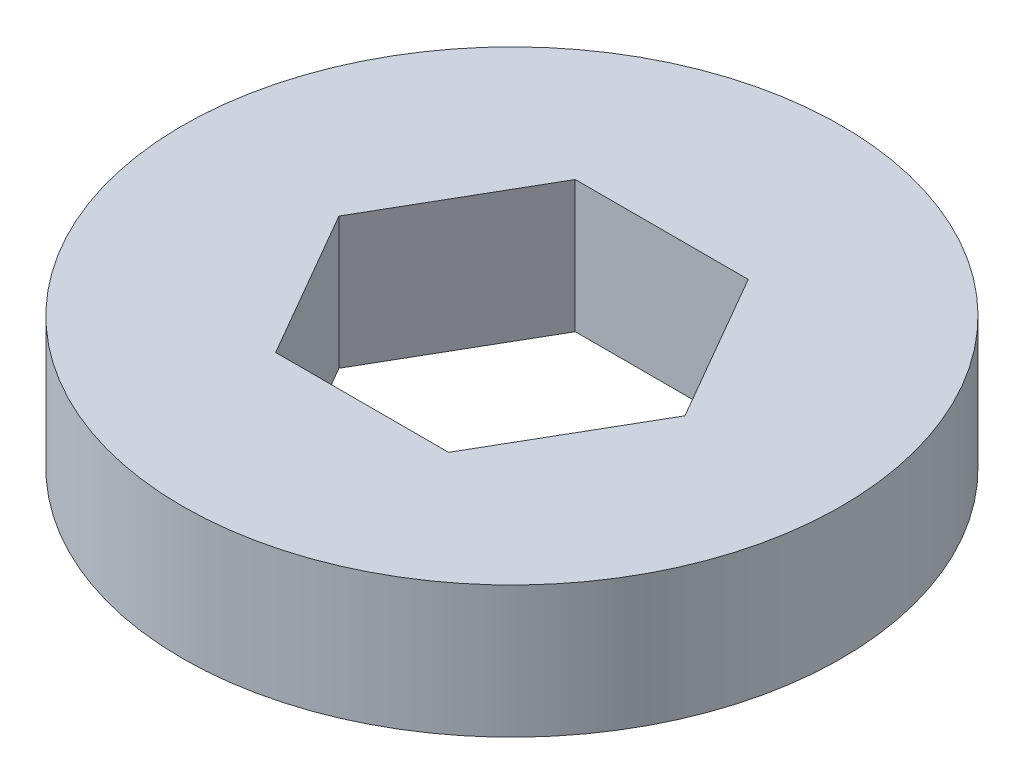
ISO-10303-21;
HEADER;
FILE_DESCRIPTION(('STEP AP214'),'2;1');
FILE_NAME('part.step','',(''),(''),'','','');
FILE_SCHEMA(('AUTOMOTIVE_DESIGN { 1 0 10303 214 1 1 1 1 }'));
ENDSEC;
DATA;
#1=APPLICATION_CONTEXT('core data for automotive mechanical design processes');
#2=APPLICATION_PROTOCOL_DEFINITION('international standard','automotive_design',2000,#1);
#3=PRODUCT_CONTEXT('',#1,'mechanical');
#4=PRODUCT('Part','Part','',(#3));
#5=PRODUCT_RELATED_PRODUCT_CATEGORY('part','',(#4));
#6=PRODUCT_DEFINITION_FORMATION('','',#4);
#7=PRODUCT_DEFINITION_CONTEXT('part definition',#1,'design');
#8=PRODUCT_DEFINITION('design','',#6,#7);
#9=PRODUCT_DEFINITION_SHAPE('','',#8);
#10=(LENGTH_UNIT() NAMED_UNIT(*) SI_UNIT(.MILLI.,.METRE.));
#11=(NAMED_UNIT(*) PLANE_ANGLE_UNIT() SI_UNIT($,.RADIAN.));
#12=(NAMED_UNIT(*) SI_UNIT($,.STERADIAN.) SOLID_ANGLE_UNIT());
#13=UNCERTAINTY_MEASURE_WITH_UNIT(LENGTH_MEASURE(1.E-05),#10,'distance_accuracy_value','');
#14=(GEOMETRIC_REPRESENTATION_CONTEXT(3) GLOBAL_UNCERTAINTY_ASSIGNED_CONTEXT((#13)) GLOBAL_UNIT_ASSIGNED_CONTEXT((#10,
#11,#12)) REPRESENTATION_CONTEXT('',''));
#15=CARTESIAN_POINT('',(0.,0.,0.));
#16=DIRECTION('',(0.,0.,1.));
#17=DIRECTION('',(1.,0.,0.));
#18=AXIS2_PLACEMENT_3D('',#15,#16,#17);
#19=CARTESIAN_POINT('',(0.,5.588,0.));
#20=DIRECTION('',(0.,1.,0.));
#21=DIRECTION('',(0.,0.,1.));
#22=AXIS2_PLACEMENT_3D('',#19,#20,#21);
#23=PLANE('',#22);
#24=CARTESIAN_POINT('',(0.,5.588,0.));
#25=DIRECTION('',(0.,1.,0.));
#26=DIRECTION('',(0.,0.,1.));
#27=AXIS2_PLACEMENT_3D('',#24,#25,#26);
#28=CIRCLE('',#27,13.97);
#29=CARTESIAN_POINT('',(0.,5.588,13.97));
#30=VERTEX_POINT('',#29);
#31=EDGE_CURVE('E11',#30,#30,#28,.T.);
#32=ORIENTED_EDGE('',*,*,#31,.T.);
#33=EDGE_LOOP('',(#32));
#34=FACE_BOUND('',#33,.T.);
#35=DIRECTION('',(-0.5,0.,-0.866025403784438));
#36=VECTOR('',#35,1.);
#37=CARTESIAN_POINT('',(7.33234841870825,5.588,0.));
#38=LINE('',#37,#36);
#39=CARTESIAN_POINT('',(7.33234841870825,5.588,0.));
#40=VERTEX_POINT('',#39);
#41=CARTESIAN_POINT('',(3.66617420935412,5.588,-6.35));
#42=VERTEX_POINT('',#41);
#43=EDGE_CURVE('E102',#40,#42,#38,.T.);
#44=ORIENTED_EDGE('',*,*,#43,.F.);
#45=DIRECTION('',(0.5,0.,-0.866025403784439));
#46=VECTOR('',#45,1.);
#47=CARTESIAN_POINT('',(3.66617420935412,5.588,6.35));
#48=LINE('',#47,#46);
#49=CARTESIAN_POINT('',(3.66617420935412,5.588,6.35));
#50=VERTEX_POINT('',#49);
#51=EDGE_CURVE('E93',#50,#40,#48,.T.);
#52=ORIENTED_EDGE('',*,*,#51,.F.);
#53=DIRECTION('',(1.,0.,0.));
#54=VECTOR('',#53,1.);
#55=CARTESIAN_POINT('',(-3.66617420935413,5.588,6.35));
#56=LINE('',#55,#54);
#57=CARTESIAN_POINT('',(-3.66617420935413,5.588,6.35));
#58=VERTEX_POINT('',#57);
#59=EDGE_CURVE('E127',#58,#50,#56,.T.);
#60=ORIENTED_EDGE('',*,*,#59,.F.);
#61=DIRECTION('',(0.5,0.,0.866025403784439));
#62=VECTOR('',#61,1.);
#63=CARTESIAN_POINT('',(-7.33234841870825,5.588,0.));
#64=LINE('',#63,#62);
#65=CARTESIAN_POINT('',(-7.33234841870825,5.588,0.));
#66=VERTEX_POINT('',#65);
#67=EDGE_CURVE('E124',#66,#58,#64,.T.);
#68=ORIENTED_EDGE('',*,*,#67,.F.);
#69=DIRECTION('',(-0.5,0.,0.866025403784439));
#70=VECTOR('',#69,1.);
#71=CARTESIAN_POINT('',(-3.66617420935412,5.588,-6.35));
#72=LINE('',#71,#70);
#73=CARTESIAN_POINT('',(-3.66617420935412,5.588,-6.35));
#74=VERTEX_POINT('',#73);
#75=EDGE_CURVE('E119',#74,#66,#72,.T.);
#76=ORIENTED_EDGE('',*,*,#75,.F.);
#77=DIRECTION('',(-1.,0.,0.));
#78=VECTOR('',#77,1.);
#79=CARTESIAN_POINT('',(3.66617420935412,5.588,-6.35));
#80=LINE('',#79,#78);
#81=EDGE_CURVE('E115',#42,#74,#80,.T.);
#82=ORIENTED_EDGE('',*,*,#81,.F.);
#83=EDGE_LOOP('',(#44,#52,#60,#68,#76,#82));
#84=FACE_BOUND('',#83,.T.);
#85=ADVANCED_FACE('F39',(#34,#84),#23,.T.);
#86=CARTESIAN_POINT('',(0.,0.,0.));
#87=DIRECTION('',(0.,1.,0.));
#88=DIRECTION('',(0.,0.,1.));
#89=AXIS2_PLACEMENT_3D('',#86,#87,#88);
#90=PLANE('',#89);
#91=CARTESIAN_POINT('',(0.,0.,0.));
#92=DIRECTION('',(0.,1.,0.));
#93=DIRECTION('',(0.,0.,1.));
#94=AXIS2_PLACEMENT_3D('',#91,#92,#93);
#95=CIRCLE('',#94,13.97);
#96=CARTESIAN_POINT('',(0.,0.,13.97));
#97=VERTEX_POINT('',#96);
#98=EDGE_CURVE('E43',#97,#97,#95,.T.);
#99=ORIENTED_EDGE('',*,*,#98,.F.);
#100=EDGE_LOOP('',(#99));
#101=FACE_BOUND('',#100,.T.);
#102=DIRECTION('',(0.5,0.,-0.866025403784439));
#103=VECTOR('',#102,1.);
#104=CARTESIAN_POINT('',(3.66617420935412,0.,6.35));
#105=LINE('',#104,#103);
#106=CARTESIAN_POINT('',(3.66617420935412,0.,6.35));
#107=VERTEX_POINT('',#106);
#108=CARTESIAN_POINT('',(7.33234841870825,0.,0.));
#109=VERTEX_POINT('',#108);
#110=EDGE_CURVE('E63',#107,#109,#105,.T.);
#111=ORIENTED_EDGE('',*,*,#110,.T.);
#112=DIRECTION('',(-0.5,0.,-0.866025403784438));
#113=VECTOR('',#112,1.);
#114=CARTESIAN_POINT('',(7.33234841870825,0.,0.));
#115=LINE('',#114,#113);
#116=CARTESIAN_POINT('',(3.66617420935412,0.,-6.35));
#117=VERTEX_POINT('',#116);
#118=EDGE_CURVE('E109',#109,#117,#115,.T.);
#119=ORIENTED_EDGE('',*,*,#118,.T.);
#120=DIRECTION('',(-1.,0.,0.));
#121=VECTOR('',#120,1.);
#122=CARTESIAN_POINT('',(3.66617420935412,0.,-6.35));
#123=LINE('',#122,#121);
#124=CARTESIAN_POINT('',(-3.66617420935412,0.,-6.35));
#125=VERTEX_POINT('',#124);
#126=EDGE_CURVE('E134',#117,#125,#123,.T.);
#127=ORIENTED_EDGE('',*,*,#126,.T.);
#128=DIRECTION('',(-0.5,0.,0.866025403784439));
#129=VECTOR('',#128,1.);
#130=CARTESIAN_POINT('',(-3.66617420935412,0.,-6.35));
#131=LINE('',#130,#129);
#132=CARTESIAN_POINT('',(-7.33234841870825,0.,0.));
#133=VERTEX_POINT('',#132);
#134=EDGE_CURVE('E138',#125,#133,#131,.T.);
#135=ORIENTED_EDGE('',*,*,#134,.T.);
#136=DIRECTION('',(0.5,0.,0.866025403784439));
#137=VECTOR('',#136,1.);
#138=CARTESIAN_POINT('',(-7.33234841870825,0.,0.));
#139=LINE('',#138,#137);
#140=CARTESIAN_POINT('',(-3.66617420935413,0.,6.35));
#141=VERTEX_POINT('',#140);
#142=EDGE_CURVE('E142',#133,#141,#139,.T.);
#143=ORIENTED_EDGE('',*,*,#142,.T.);
#144=DIRECTION('',(1.,0.,0.));
#145=VECTOR('',#144,1.);
#146=CARTESIAN_POINT('',(-3.66617420935413,0.,6.35));
#147=LINE('',#146,#145);
#148=EDGE_CURVE('E103',#141,#107,#147,.T.);
#149=ORIENTED_EDGE('',*,*,#148,.T.);
#150=EDGE_LOOP('',(#111,#119,#127,#135,#143,#149));
#151=FACE_BOUND('',#150,.T.);
#152=ADVANCED_FACE('F166',(#101,#151),#90,.F.);
#153=CARTESIAN_POINT('',(0.,5.588,0.));
#154=DIRECTION('',(0.,-1.,0.));
#155=DIRECTION('',(0.,0.,-1.));
#156=AXIS2_PLACEMENT_3D('',#153,#154,#155);
#157=CYLINDRICAL_SURFACE('',#156,13.97);
#158=ORIENTED_EDGE('',*,*,#31,.F.);
#159=EDGE_LOOP('',(#158));
#160=FACE_BOUND('',#159,.T.);
#161=ORIENTED_EDGE('',*,*,#98,.T.);
#162=EDGE_LOOP('',(#161));
#163=FACE_BOUND('',#162,.T.);
#164=ADVANCED_FACE('F41',(#160,#163),#157,.T.);
#165=CARTESIAN_POINT('',(3.66617420935412,5.588,6.35));
#166=DIRECTION('',(-0.866025403784439,0.,-0.5));
#167=DIRECTION('',(-0.5,0.,0.866025403784439));
#168=AXIS2_PLACEMENT_3D('',#165,#166,#167);
#169=PLANE('',#168);
#170=ORIENTED_EDGE('',*,*,#110,.F.);
#171=DIRECTION('',(0.,-1.,0.));
#172=VECTOR('',#171,1.);
#173=CARTESIAN_POINT('',(3.66617420935412,5.588,6.35));
#174=LINE('',#173,#172);
#175=EDGE_CURVE('E97',#50,#107,#174,.T.);
#176=ORIENTED_EDGE('',*,*,#175,.F.);
#177=ORIENTED_EDGE('',*,*,#51,.T.);
#178=DIRECTION('',(0.,-1.,0.));
#179=VECTOR('',#178,1.);
#180=CARTESIAN_POINT('',(7.33234841870825,5.588,0.));
#181=LINE('',#180,#179);
#182=EDGE_CURVE('E96',#40,#109,#181,.T.);
#183=ORIENTED_EDGE('',*,*,#182,.T.);
#184=EDGE_LOOP('',(#170,#176,#177,#183));
#185=FACE_BOUND('',#184,.T.);
#186=ADVANCED_FACE('F95',(#185),#169,.T.);
#187=CARTESIAN_POINT('',(7.33234841870825,5.588,0.));
#188=DIRECTION('',(-0.866025403784439,0.,0.5));
#189=DIRECTION('',(0.5,0.,0.866025403784439));
#190=AXIS2_PLACEMENT_3D('',#187,#188,#189);
#191=PLANE('',#190);
#192=ORIENTED_EDGE('',*,*,#118,.F.);
#193=ORIENTED_EDGE('',*,*,#182,.F.);
#194=ORIENTED_EDGE('',*,*,#43,.T.);
#195=DIRECTION('',(0.,-1.,0.));
#196=VECTOR('',#195,1.);
#197=CARTESIAN_POINT('',(3.66617420935412,5.588,-6.35));
#198=LINE('',#197,#196);
#199=EDGE_CURVE('E111',#42,#117,#198,.T.);
#200=ORIENTED_EDGE('',*,*,#199,.T.);
#201=EDGE_LOOP('',(#192,#193,#194,#200));
#202=FACE_BOUND('',#201,.T.);
#203=ADVANCED_FACE('F106',(#202),#191,.T.);
#204=CARTESIAN_POINT('',(3.66617420935412,5.588,-6.35));
#205=DIRECTION('',(0.,0.,1.));
#206=DIRECTION('',(1.,0.,0.));
#207=AXIS2_PLACEMENT_3D('',#204,#205,#206);
#208=PLANE('',#207);
#209=ORIENTED_EDGE('',*,*,#126,.F.);
#210=ORIENTED_EDGE('',*,*,#199,.F.);
#211=ORIENTED_EDGE('',*,*,#81,.T.);
#212=DIRECTION('',(0.,-1.,0.));
#213=VECTOR('',#212,1.);
#214=CARTESIAN_POINT('',(-3.66617420935412,5.588,-6.35));
#215=LINE('',#214,#213);
#216=EDGE_CURVE('E156',#74,#125,#215,.T.);
#217=ORIENTED_EDGE('',*,*,#216,.T.);
#218=EDGE_LOOP('',(#209,#210,#211,#217));
#219=FACE_BOUND('',#218,.T.);
#220=ADVANCED_FACE('F162',(#219),#208,.T.);
#221=CARTESIAN_POINT('',(-3.66617420935412,5.588,-6.35));
#222=DIRECTION('',(0.866025403784439,0.,0.5));
#223=DIRECTION('',(0.5,0.,-0.866025403784439));
#224=AXIS2_PLACEMENT_3D('',#221,#222,#223);
#225=PLANE('',#224);
#226=ORIENTED_EDGE('',*,*,#134,.F.);
#227=ORIENTED_EDGE('',*,*,#216,.F.);
#228=ORIENTED_EDGE('',*,*,#75,.T.);
#229=DIRECTION('',(0.,-1.,0.));
#230=VECTOR('',#229,1.);
#231=CARTESIAN_POINT('',(-7.33234841870825,5.588,0.));
#232=LINE('',#231,#230);
#233=EDGE_CURVE('E153',#66,#133,#232,.T.);
#234=ORIENTED_EDGE('',*,*,#233,.T.);
#235=EDGE_LOOP('',(#226,#227,#228,#234));
#236=FACE_BOUND('',#235,.T.);
#237=ADVANCED_FACE('F174',(#236),#225,.T.);
#238=CARTESIAN_POINT('',(-7.33234841870825,5.588,0.));
#239=DIRECTION('',(0.866025403784439,0.,-0.5));
#240=DIRECTION('',(-0.5,0.,-0.866025403784439));
#241=AXIS2_PLACEMENT_3D('',#238,#239,#240);
#242=PLANE('',#241);
#243=ORIENTED_EDGE('',*,*,#142,.F.);
#244=ORIENTED_EDGE('',*,*,#233,.F.);
#245=ORIENTED_EDGE('',*,*,#67,.T.);
#246=DIRECTION('',(0.,-1.,0.));
#247=VECTOR('',#246,1.);
#248=CARTESIAN_POINT('',(-3.66617420935413,5.588,6.35));
#249=LINE('',#248,#247);
#250=EDGE_CURVE('E55',#58,#141,#249,.T.);
#251=ORIENTED_EDGE('',*,*,#250,.T.);
#252=EDGE_LOOP('',(#243,#244,#245,#251));
#253=FACE_BOUND('',#252,.T.);
#254=ADVANCED_FACE('F172',(#253),#242,.T.);
#255=CARTESIAN_POINT('',(-3.66617420935413,5.588,6.35));
#256=DIRECTION('',(0.,0.,-1.));
#257=DIRECTION('',(-1.,0.,0.));
#258=AXIS2_PLACEMENT_3D('',#255,#256,#257);
#259=PLANE('',#258);
#260=ORIENTED_EDGE('',*,*,#148,.F.);
#261=ORIENTED_EDGE('',*,*,#250,.F.);
#262=ORIENTED_EDGE('',*,*,#59,.T.);
#263=ORIENTED_EDGE('',*,*,#175,.T.);
#264=EDGE_LOOP('',(#260,#261,#262,#263));
#265=FACE_BOUND('',#264,.T.);
#266=ADVANCED_FACE('F168',(#265),#259,.T.);
#267=CLOSED_SHELL('',(#85,#152,#164,#186,#203,#220,#237,#254,#266));
#268=MANIFOLD_SOLID_BREP('B2',#267);
#269=ADVANCED_BREP_SHAPE_REPRESENTATION('',(#18,#268),#14);
#270=SHAPE_DEFINITION_REPRESENTATION(#9,#269);
ENDSEC;
END-ISO-10303-21;
